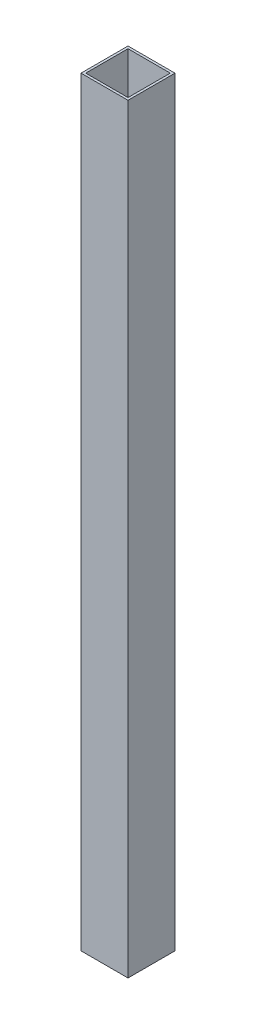
ISO-10303-21;
HEADER;
FILE_DESCRIPTION(('STEP AP214'),'2;1');
FILE_NAME('part.step','',(''),(''),'','','');
FILE_SCHEMA(('AUTOMOTIVE_DESIGN { 1 0 10303 214 1 1 1 1 }'));
ENDSEC;
DATA;
#1=APPLICATION_CONTEXT('core data for automotive mechanical design processes');
#2=APPLICATION_PROTOCOL_DEFINITION('international standard','automotive_design',2000,#1);
#3=PRODUCT_CONTEXT('',#1,'mechanical');
#4=PRODUCT('Part','Part','',(#3));
#5=PRODUCT_RELATED_PRODUCT_CATEGORY('part','',(#4));
#6=PRODUCT_DEFINITION_FORMATION('','',#4);
#7=PRODUCT_DEFINITION_CONTEXT('part definition',#1,'design');
#8=PRODUCT_DEFINITION('design','',#6,#7);
#9=PRODUCT_DEFINITION_SHAPE('','',#8);
#10=(LENGTH_UNIT() NAMED_UNIT(*) SI_UNIT(.MILLI.,.METRE.));
#11=(NAMED_UNIT(*) PLANE_ANGLE_UNIT() SI_UNIT($,.RADIAN.));
#12=(NAMED_UNIT(*) SI_UNIT($,.STERADIAN.) SOLID_ANGLE_UNIT());
#13=UNCERTAINTY_MEASURE_WITH_UNIT(LENGTH_MEASURE(1.E-05),#10,'distance_accuracy_value','');
#14=(GEOMETRIC_REPRESENTATION_CONTEXT(3) GLOBAL_UNCERTAINTY_ASSIGNED_CONTEXT((#13)) GLOBAL_UNIT_ASSIGNED_CONTEXT((#10,
#11,#12)) REPRESENTATION_CONTEXT('',''));
#15=CARTESIAN_POINT('',(0.,0.,0.));
#16=DIRECTION('',(0.,0.,1.));
#17=DIRECTION('',(1.,0.,0.));
#18=AXIS2_PLACEMENT_3D('',#15,#16,#17);
#19=CARTESIAN_POINT('',(0.,410.8,0.));
#20=DIRECTION('',(0.,-1.,0.));
#21=DIRECTION('',(0.,0.,-1.));
#22=AXIS2_PLACEMENT_3D('',#19,#20,#21);
#23=PLANE('',#22);
#24=DIRECTION('',(0.,0.,-1.));
#25=VECTOR('',#24,1.);
#26=CARTESIAN_POINT('',(25.4,410.8,-25.4));
#27=LINE('',#26,#25);
#28=CARTESIAN_POINT('',(25.4,410.8,0.));
#29=VERTEX_POINT('',#28);
#30=CARTESIAN_POINT('',(25.4,410.8,-25.4));
#31=VERTEX_POINT('',#30);
#32=EDGE_CURVE('E134',#29,#31,#27,.T.);
#33=ORIENTED_EDGE('',*,*,#32,.T.);
#34=DIRECTION('',(-1.,0.,0.));
#35=VECTOR('',#34,1.);
#36=CARTESIAN_POINT('',(25.4,410.8,-25.4));
#37=LINE('',#36,#35);
#38=CARTESIAN_POINT('',(0.,410.8,-25.4));
#39=VERTEX_POINT('',#38);
#40=EDGE_CURVE('E137',#31,#39,#37,.T.);
#41=ORIENTED_EDGE('',*,*,#40,.T.);
#42=DIRECTION('',(0.,0.,1.));
#43=VECTOR('',#42,1.);
#44=CARTESIAN_POINT('',(0.,410.8,-25.4));
#45=LINE('',#44,#43);
#46=CARTESIAN_POINT('',(0.,410.8,0.));
#47=VERTEX_POINT('',#46);
#48=EDGE_CURVE('E140',#39,#47,#45,.T.);
#49=ORIENTED_EDGE('',*,*,#48,.T.);
#50=DIRECTION('',(1.,0.,0.));
#51=VECTOR('',#50,1.);
#52=CARTESIAN_POINT('',(25.4,410.8,0.));
#53=LINE('',#52,#51);
#54=EDGE_CURVE('E142',#47,#29,#53,.T.);
#55=ORIENTED_EDGE('',*,*,#54,.T.);
#56=EDGE_LOOP('',(#33,#41,#49,#55));
#57=FACE_BOUND('',#56,.T.);
#58=DIRECTION('',(0.,0.,1.));
#59=VECTOR('',#58,1.);
#60=CARTESIAN_POINT('',(1.27,410.8,-1.27));
#61=LINE('',#60,#59);
#62=CARTESIAN_POINT('',(1.27,410.8,-24.13));
#63=VERTEX_POINT('',#62);
#64=CARTESIAN_POINT('',(1.27,410.8,-1.27));
#65=VERTEX_POINT('',#64);
#66=EDGE_CURVE('E98',#63,#65,#61,.T.);
#67=ORIENTED_EDGE('',*,*,#66,.F.);
#68=DIRECTION('',(-1.,0.,0.));
#69=VECTOR('',#68,1.);
#70=CARTESIAN_POINT('',(1.27,410.8,-24.13));
#71=LINE('',#70,#69);
#72=CARTESIAN_POINT('',(24.13,410.8,-24.13));
#73=VERTEX_POINT('',#72);
#74=EDGE_CURVE('E120',#73,#63,#71,.T.);
#75=ORIENTED_EDGE('',*,*,#74,.F.);
#76=DIRECTION('',(0.,0.,-1.));
#77=VECTOR('',#76,1.);
#78=CARTESIAN_POINT('',(24.13,410.8,-1.27));
#79=LINE('',#78,#77);
#80=CARTESIAN_POINT('',(24.13,410.8,-1.27));
#81=VERTEX_POINT('',#80);
#82=EDGE_CURVE('E118',#81,#73,#79,.T.);
#83=ORIENTED_EDGE('',*,*,#82,.F.);
#84=DIRECTION('',(1.,0.,0.));
#85=VECTOR('',#84,1.);
#86=CARTESIAN_POINT('',(1.27,410.8,-1.27));
#87=LINE('',#86,#85);
#88=EDGE_CURVE('E106',#65,#81,#87,.T.);
#89=ORIENTED_EDGE('',*,*,#88,.F.);
#90=EDGE_LOOP('',(#67,#75,#83,#89));
#91=FACE_BOUND('',#90,.T.);
#92=ADVANCED_FACE('F33',(#57,#91),#23,.F.);
#93=CARTESIAN_POINT('',(0.,0.,0.));
#94=DIRECTION('',(0.,-1.,0.));
#95=DIRECTION('',(0.,0.,-1.));
#96=AXIS2_PLACEMENT_3D('',#93,#94,#95);
#97=PLANE('',#96);
#98=DIRECTION('',(0.,0.,-1.));
#99=VECTOR('',#98,1.);
#100=CARTESIAN_POINT('',(25.4,0.,-25.4));
#101=LINE('',#100,#99);
#102=CARTESIAN_POINT('',(25.4,0.,0.));
#103=VERTEX_POINT('',#102);
#104=CARTESIAN_POINT('',(25.4,0.,-25.4));
#105=VERTEX_POINT('',#104);
#106=EDGE_CURVE('E114',#103,#105,#101,.T.);
#107=ORIENTED_EDGE('',*,*,#106,.F.);
#108=DIRECTION('',(1.,0.,0.));
#109=VECTOR('',#108,1.);
#110=CARTESIAN_POINT('',(25.4,0.,0.));
#111=LINE('',#110,#109);
#112=CARTESIAN_POINT('',(0.,0.,0.));
#113=VERTEX_POINT('',#112);
#114=EDGE_CURVE('E138',#113,#103,#111,.T.);
#115=ORIENTED_EDGE('',*,*,#114,.F.);
#116=DIRECTION('',(0.,0.,1.));
#117=VECTOR('',#116,1.);
#118=CARTESIAN_POINT('',(0.,0.,-25.4));
#119=LINE('',#118,#117);
#120=CARTESIAN_POINT('',(0.,0.,-25.4));
#121=VERTEX_POINT('',#120);
#122=EDGE_CURVE('E149',#121,#113,#119,.T.);
#123=ORIENTED_EDGE('',*,*,#122,.F.);
#124=DIRECTION('',(-1.,0.,0.));
#125=VECTOR('',#124,1.);
#126=CARTESIAN_POINT('',(25.4,0.,-25.4));
#127=LINE('',#126,#125);
#128=EDGE_CURVE('E147',#105,#121,#127,.T.);
#129=ORIENTED_EDGE('',*,*,#128,.F.);
#130=EDGE_LOOP('',(#107,#115,#123,#129));
#131=FACE_BOUND('',#130,.T.);
#132=DIRECTION('',(-1.,0.,0.));
#133=VECTOR('',#132,1.);
#134=CARTESIAN_POINT('',(1.27,0.,-24.13));
#135=LINE('',#134,#133);
#136=CARTESIAN_POINT('',(24.13,0.,-24.13));
#137=VERTEX_POINT('',#136);
#138=CARTESIAN_POINT('',(1.27,0.,-24.13));
#139=VERTEX_POINT('',#138);
#140=EDGE_CURVE('E107',#137,#139,#135,.T.);
#141=ORIENTED_EDGE('',*,*,#140,.T.);
#142=DIRECTION('',(0.,0.,1.));
#143=VECTOR('',#142,1.);
#144=CARTESIAN_POINT('',(1.27,0.,-1.27));
#145=LINE('',#144,#143);
#146=CARTESIAN_POINT('',(1.27,0.,-1.27));
#147=VERTEX_POINT('',#146);
#148=EDGE_CURVE('E56',#139,#147,#145,.T.);
#149=ORIENTED_EDGE('',*,*,#148,.T.);
#150=DIRECTION('',(1.,0.,0.));
#151=VECTOR('',#150,1.);
#152=CARTESIAN_POINT('',(1.27,0.,-1.27));
#153=LINE('',#152,#151);
#154=CARTESIAN_POINT('',(24.13,0.,-1.27));
#155=VERTEX_POINT('',#154);
#156=EDGE_CURVE('E113',#147,#155,#153,.T.);
#157=ORIENTED_EDGE('',*,*,#156,.T.);
#158=DIRECTION('',(0.,0.,-1.));
#159=VECTOR('',#158,1.);
#160=CARTESIAN_POINT('',(24.13,0.,-1.27));
#161=LINE('',#160,#159);
#162=EDGE_CURVE('E126',#155,#137,#161,.T.);
#163=ORIENTED_EDGE('',*,*,#162,.T.);
#164=EDGE_LOOP('',(#141,#149,#157,#163));
#165=FACE_BOUND('',#164,.T.);
#166=ADVANCED_FACE('F167',(#131,#165),#97,.T.);
#167=CARTESIAN_POINT('',(25.4,410.8,-25.4));
#168=DIRECTION('',(-1.,0.,0.));
#169=DIRECTION('',(0.,0.,1.));
#170=AXIS2_PLACEMENT_3D('',#167,#168,#169);
#171=PLANE('',#170);
#172=ORIENTED_EDGE('',*,*,#106,.T.);
#173=DIRECTION('',(0.,-1.,0.));
#174=VECTOR('',#173,1.);
#175=CARTESIAN_POINT('',(25.4,410.8,-25.4));
#176=LINE('',#175,#174);
#177=EDGE_CURVE('E11',#31,#105,#176,.T.);
#178=ORIENTED_EDGE('',*,*,#177,.F.);
#179=ORIENTED_EDGE('',*,*,#32,.F.);
#180=DIRECTION('',(0.,-1.,0.));
#181=VECTOR('',#180,1.);
#182=CARTESIAN_POINT('',(25.4,410.8,0.));
#183=LINE('',#182,#181);
#184=EDGE_CURVE('E144',#29,#103,#183,.T.);
#185=ORIENTED_EDGE('',*,*,#184,.T.);
#186=EDGE_LOOP('',(#172,#178,#179,#185));
#187=FACE_BOUND('',#186,.T.);
#188=ADVANCED_FACE('F35',(#187),#171,.F.);
#189=CARTESIAN_POINT('',(25.4,410.8,-25.4));
#190=DIRECTION('',(0.,0.,1.));
#191=DIRECTION('',(1.,0.,0.));
#192=AXIS2_PLACEMENT_3D('',#189,#190,#191);
#193=PLANE('',#192);
#194=ORIENTED_EDGE('',*,*,#128,.T.);
#195=DIRECTION('',(0.,-1.,0.));
#196=VECTOR('',#195,1.);
#197=CARTESIAN_POINT('',(0.,410.8,-25.4));
#198=LINE('',#197,#196);
#199=EDGE_CURVE('E41',#39,#121,#198,.T.);
#200=ORIENTED_EDGE('',*,*,#199,.F.);
#201=ORIENTED_EDGE('',*,*,#40,.F.);
#202=ORIENTED_EDGE('',*,*,#177,.T.);
#203=EDGE_LOOP('',(#194,#200,#201,#202));
#204=FACE_BOUND('',#203,.T.);
#205=ADVANCED_FACE('F177',(#204),#193,.F.);
#206=CARTESIAN_POINT('',(0.,410.8,-25.4));
#207=DIRECTION('',(1.,0.,0.));
#208=DIRECTION('',(0.,0.,-1.));
#209=AXIS2_PLACEMENT_3D('',#206,#207,#208);
#210=PLANE('',#209);
#211=ORIENTED_EDGE('',*,*,#122,.T.);
#212=DIRECTION('',(0.,-1.,0.));
#213=VECTOR('',#212,1.);
#214=CARTESIAN_POINT('',(0.,410.8,0.));
#215=LINE('',#214,#213);
#216=EDGE_CURVE('E154',#47,#113,#215,.T.);
#217=ORIENTED_EDGE('',*,*,#216,.F.);
#218=ORIENTED_EDGE('',*,*,#48,.F.);
#219=ORIENTED_EDGE('',*,*,#199,.T.);
#220=EDGE_LOOP('',(#211,#217,#218,#219));
#221=FACE_BOUND('',#220,.T.);
#222=ADVANCED_FACE('F161',(#221),#210,.F.);
#223=CARTESIAN_POINT('',(25.4,410.8,0.));
#224=DIRECTION('',(0.,0.,-1.));
#225=DIRECTION('',(-1.,0.,0.));
#226=AXIS2_PLACEMENT_3D('',#223,#224,#225);
#227=PLANE('',#226);
#228=ORIENTED_EDGE('',*,*,#114,.T.);
#229=ORIENTED_EDGE('',*,*,#184,.F.);
#230=ORIENTED_EDGE('',*,*,#54,.F.);
#231=ORIENTED_EDGE('',*,*,#216,.T.);
#232=EDGE_LOOP('',(#228,#229,#230,#231));
#233=FACE_BOUND('',#232,.T.);
#234=ADVANCED_FACE('F171',(#233),#227,.F.);
#235=CARTESIAN_POINT('',(1.27,410.8,-1.27));
#236=DIRECTION('',(1.,0.,0.));
#237=DIRECTION('',(0.,0.,-1.));
#238=AXIS2_PLACEMENT_3D('',#235,#236,#237);
#239=PLANE('',#238);
#240=ORIENTED_EDGE('',*,*,#148,.F.);
#241=DIRECTION('',(0.,-1.,0.));
#242=VECTOR('',#241,1.);
#243=CARTESIAN_POINT('',(1.27,410.8,-24.13));
#244=LINE('',#243,#242);
#245=EDGE_CURVE('E102',#63,#139,#244,.T.);
#246=ORIENTED_EDGE('',*,*,#245,.F.);
#247=ORIENTED_EDGE('',*,*,#66,.T.);
#248=DIRECTION('',(0.,-1.,0.));
#249=VECTOR('',#248,1.);
#250=CARTESIAN_POINT('',(1.27,410.8,-1.27));
#251=LINE('',#250,#249);
#252=EDGE_CURVE('E101',#65,#147,#251,.T.);
#253=ORIENTED_EDGE('',*,*,#252,.T.);
#254=EDGE_LOOP('',(#240,#246,#247,#253));
#255=FACE_BOUND('',#254,.T.);
#256=ADVANCED_FACE('F100',(#255),#239,.T.);
#257=CARTESIAN_POINT('',(1.27,410.8,-1.27));
#258=DIRECTION('',(0.,0.,-1.));
#259=DIRECTION('',(-1.,0.,0.));
#260=AXIS2_PLACEMENT_3D('',#257,#258,#259);
#261=PLANE('',#260);
#262=ORIENTED_EDGE('',*,*,#156,.F.);
#263=ORIENTED_EDGE('',*,*,#252,.F.);
#264=ORIENTED_EDGE('',*,*,#88,.T.);
#265=DIRECTION('',(0.,-1.,0.));
#266=VECTOR('',#265,1.);
#267=CARTESIAN_POINT('',(24.13,410.8,-1.27));
#268=LINE('',#267,#266);
#269=EDGE_CURVE('E115',#81,#155,#268,.T.);
#270=ORIENTED_EDGE('',*,*,#269,.T.);
#271=EDGE_LOOP('',(#262,#263,#264,#270));
#272=FACE_BOUND('',#271,.T.);
#273=ADVANCED_FACE('F110',(#272),#261,.T.);
#274=CARTESIAN_POINT('',(24.13,410.8,-1.27));
#275=DIRECTION('',(-1.,0.,0.));
#276=DIRECTION('',(0.,0.,1.));
#277=AXIS2_PLACEMENT_3D('',#274,#275,#276);
#278=PLANE('',#277);
#279=ORIENTED_EDGE('',*,*,#162,.F.);
#280=ORIENTED_EDGE('',*,*,#269,.F.);
#281=ORIENTED_EDGE('',*,*,#82,.T.);
#282=DIRECTION('',(0.,-1.,0.));
#283=VECTOR('',#282,1.);
#284=CARTESIAN_POINT('',(24.13,410.8,-24.13));
#285=LINE('',#284,#283);
#286=EDGE_CURVE('E48',#73,#137,#285,.T.);
#287=ORIENTED_EDGE('',*,*,#286,.T.);
#288=EDGE_LOOP('',(#279,#280,#281,#287));
#289=FACE_BOUND('',#288,.T.);
#290=ADVANCED_FACE('F200',(#289),#278,.T.);
#291=CARTESIAN_POINT('',(1.27,410.8,-24.13));
#292=DIRECTION('',(0.,0.,1.));
#293=DIRECTION('',(1.,0.,0.));
#294=AXIS2_PLACEMENT_3D('',#291,#292,#293);
#295=PLANE('',#294);
#296=ORIENTED_EDGE('',*,*,#140,.F.);
#297=ORIENTED_EDGE('',*,*,#286,.F.);
#298=ORIENTED_EDGE('',*,*,#74,.T.);
#299=ORIENTED_EDGE('',*,*,#245,.T.);
#300=EDGE_LOOP('',(#296,#297,#298,#299));
#301=FACE_BOUND('',#300,.T.);
#302=ADVANCED_FACE('F204',(#301),#295,.T.);
#303=CLOSED_SHELL('',(#92,#166,#188,#205,#222,#234,#256,#273,#290,#302));
#304=MANIFOLD_SOLID_BREP('B2',#303);
#305=ADVANCED_BREP_SHAPE_REPRESENTATION('',(#18,#304),#14);
#306=SHAPE_DEFINITION_REPRESENTATION(#9,#305);
ENDSEC;
END-ISO-10303-21;
